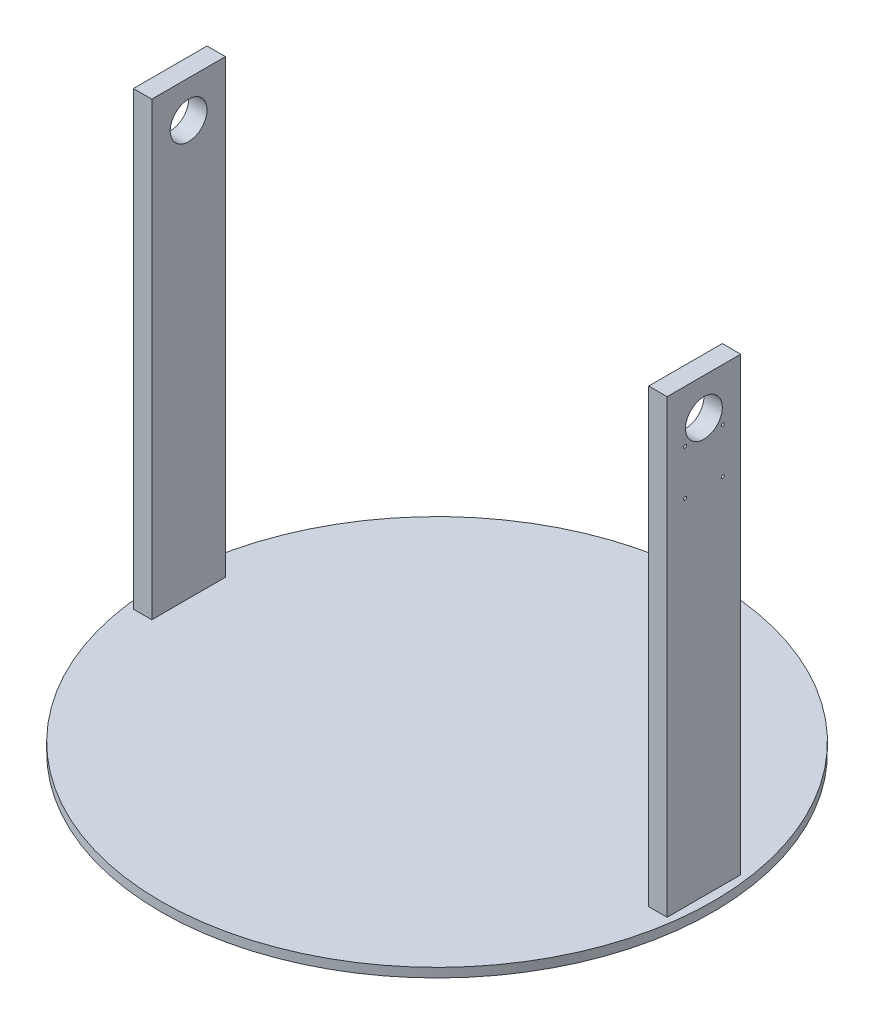
ISO-10303-21;
HEADER;
FILE_DESCRIPTION(('STEP AP214'),'2;1');
FILE_NAME('part.step','',(''),(''),'','','');
FILE_SCHEMA(('AUTOMOTIVE_DESIGN { 1 0 10303 214 1 1 1 1 }'));
ENDSEC;
DATA;
#1=APPLICATION_CONTEXT('core data for automotive mechanical design processes');
#2=APPLICATION_PROTOCOL_DEFINITION('international standard','automotive_design',2000,#1);
#3=PRODUCT_CONTEXT('',#1,'mechanical');
#4=PRODUCT('Part','Part','',(#3));
#5=PRODUCT_RELATED_PRODUCT_CATEGORY('part','',(#4));
#6=PRODUCT_DEFINITION_FORMATION('','',#4);
#7=PRODUCT_DEFINITION_CONTEXT('part definition',#1,'design');
#8=PRODUCT_DEFINITION('design','',#6,#7);
#9=PRODUCT_DEFINITION_SHAPE('','',#8);
#10=(LENGTH_UNIT() NAMED_UNIT(*) SI_UNIT(.MILLI.,.METRE.));
#11=(NAMED_UNIT(*) PLANE_ANGLE_UNIT() SI_UNIT($,.RADIAN.));
#12=(NAMED_UNIT(*) SI_UNIT($,.STERADIAN.) SOLID_ANGLE_UNIT());
#13=UNCERTAINTY_MEASURE_WITH_UNIT(LENGTH_MEASURE(1.E-05),#10,'distance_accuracy_value','');
#14=(GEOMETRIC_REPRESENTATION_CONTEXT(3) GLOBAL_UNCERTAINTY_ASSIGNED_CONTEXT((#13)) GLOBAL_UNIT_ASSIGNED_CONTEXT((#10,
#11,#12)) REPRESENTATION_CONTEXT('',''));
#15=CARTESIAN_POINT('',(0.,0.,0.));
#16=DIRECTION('',(0.,0.,1.));
#17=DIRECTION('',(1.,0.,0.));
#18=AXIS2_PLACEMENT_3D('',#15,#16,#17);
#19=CARTESIAN_POINT('',(-145.,250.,-19.9999999999999));
#20=DIRECTION('',(0.,0.,-1.));
#21=DIRECTION('',(-1.,0.,0.));
#22=AXIS2_PLACEMENT_3D('',#19,#20,#21);
#23=PLANE('',#22);
#24=DIRECTION('',(1.,0.,0.));
#25=VECTOR('',#24,1.);
#26=CARTESIAN_POINT('',(0.,5.,-19.9999999999999));
#27=LINE('',#26,#25);
#28=CARTESIAN_POINT('',(-145.,5.,-19.9999999999999));
#29=VERTEX_POINT('',#28);
#30=CARTESIAN_POINT('',(-135.,5.,-19.9999999999999));
#31=VERTEX_POINT('',#30);
#32=EDGE_CURVE('E62',#29,#31,#27,.T.);
#33=ORIENTED_EDGE('',*,*,#32,.F.);
#34=DIRECTION('',(0.,-1.,0.));
#35=VECTOR('',#34,1.);
#36=CARTESIAN_POINT('',(-145.,250.,-19.9999999999999));
#37=LINE('',#36,#35);
#38=CARTESIAN_POINT('',(-145.,250.,-19.9999999999999));
#39=VERTEX_POINT('',#38);
#40=EDGE_CURVE('E11',#39,#29,#37,.T.);
#41=ORIENTED_EDGE('',*,*,#40,.F.);
#42=DIRECTION('',(1.,0.,0.));
#43=VECTOR('',#42,1.);
#44=CARTESIAN_POINT('',(-145.,250.,-19.9999999999999));
#45=LINE('',#44,#43);
#46=CARTESIAN_POINT('',(-135.,250.,-19.9999999999999));
#47=VERTEX_POINT('',#46);
#48=EDGE_CURVE('E176',#39,#47,#45,.T.);
#49=ORIENTED_EDGE('',*,*,#48,.T.);
#50=DIRECTION('',(0.,-1.,0.));
#51=VECTOR('',#50,1.);
#52=CARTESIAN_POINT('',(-135.,250.,-19.9999999999999));
#53=LINE('',#52,#51);
#54=EDGE_CURVE('E48',#47,#31,#53,.T.);
#55=ORIENTED_EDGE('',*,*,#54,.T.);
#56=EDGE_LOOP('',(#33,#41,#49,#55));
#57=FACE_BOUND('',#56,.T.);
#58=ADVANCED_FACE('F45',(#57),#23,.T.);
#59=CARTESIAN_POINT('',(-145.,250.,-19.9999999999999));
#60=DIRECTION('',(1.,0.,0.));
#61=DIRECTION('',(0.,0.,-1.));
#62=AXIS2_PLACEMENT_3D('',#59,#60,#61);
#63=PLANE('',#62);
#64=CARTESIAN_POINT('',(-145.,230.,0.));
#65=DIRECTION('',(1.,0.,0.));
#66=DIRECTION('',(0.,0.,-1.));
#67=AXIS2_PLACEMENT_3D('',#64,#65,#66);
#68=CIRCLE('',#67,10.);
#69=CARTESIAN_POINT('',(-145.,230.,-10.));
#70=VERTEX_POINT('',#69);
#71=EDGE_CURVE('E318',#70,#70,#68,.T.);
#72=ORIENTED_EDGE('',*,*,#71,.T.);
#73=EDGE_LOOP('',(#72));
#74=FACE_BOUND('',#73,.T.);
#75=ORIENTED_EDGE('',*,*,#40,.T.);
#76=DIRECTION('',(0.,0.,1.));
#77=VECTOR('',#76,1.);
#78=CARTESIAN_POINT('',(-145.,5.,0.));
#79=LINE('',#78,#77);
#80=CARTESIAN_POINT('',(-145.,5.,20.0000000000001));
#81=VERTEX_POINT('',#80);
#82=EDGE_CURVE('E68',#29,#81,#79,.T.);
#83=ORIENTED_EDGE('',*,*,#82,.T.);
#84=DIRECTION('',(0.,-1.,0.));
#85=VECTOR('',#84,1.);
#86=CARTESIAN_POINT('',(-145.,250.,20.0000000000001));
#87=LINE('',#86,#85);
#88=CARTESIAN_POINT('',(-145.,250.,20.0000000000001));
#89=VERTEX_POINT('',#88);
#90=EDGE_CURVE('E54',#89,#81,#87,.T.);
#91=ORIENTED_EDGE('',*,*,#90,.F.);
#92=DIRECTION('',(0.,0.,1.));
#93=VECTOR('',#92,1.);
#94=CARTESIAN_POINT('',(-145.,250.,-19.9999999999999));
#95=LINE('',#94,#93);
#96=EDGE_CURVE('E190',#39,#89,#95,.T.);
#97=ORIENTED_EDGE('',*,*,#96,.F.);
#98=EDGE_LOOP('',(#75,#83,#91,#97));
#99=FACE_BOUND('',#98,.T.);
#100=ADVANCED_FACE('F209',(#74,#99),#63,.F.);
#101=CARTESIAN_POINT('',(-145.,250.,20.0000000000001));
#102=DIRECTION('',(0.,0.,-1.));
#103=DIRECTION('',(-1.,0.,0.));
#104=AXIS2_PLACEMENT_3D('',#101,#102,#103);
#105=PLANE('',#104);
#106=ORIENTED_EDGE('',*,*,#90,.T.);
#107=DIRECTION('',(1.,0.,0.));
#108=VECTOR('',#107,1.);
#109=CARTESIAN_POINT('',(0.,5.,20.0000000000001));
#110=LINE('',#109,#108);
#111=CARTESIAN_POINT('',(-135.,5.,20.0000000000001));
#112=VERTEX_POINT('',#111);
#113=EDGE_CURVE('E152',#81,#112,#110,.T.);
#114=ORIENTED_EDGE('',*,*,#113,.T.);
#115=DIRECTION('',(0.,-1.,0.));
#116=VECTOR('',#115,1.);
#117=CARTESIAN_POINT('',(-135.,250.,20.0000000000001));
#118=LINE('',#117,#116);
#119=CARTESIAN_POINT('',(-135.,250.,20.0000000000001));
#120=VERTEX_POINT('',#119);
#121=EDGE_CURVE('E194',#120,#112,#118,.T.);
#122=ORIENTED_EDGE('',*,*,#121,.F.);
#123=DIRECTION('',(1.,0.,0.));
#124=VECTOR('',#123,1.);
#125=CARTESIAN_POINT('',(-145.,250.,20.0000000000001));
#126=LINE('',#125,#124);
#127=EDGE_CURVE('E187',#89,#120,#126,.T.);
#128=ORIENTED_EDGE('',*,*,#127,.F.);
#129=EDGE_LOOP('',(#106,#114,#122,#128));
#130=FACE_BOUND('',#129,.T.);
#131=ADVANCED_FACE('F206',(#130),#105,.F.);
#132=CARTESIAN_POINT('',(-135.,250.,-19.9999999999999));
#133=DIRECTION('',(1.,0.,0.));
#134=DIRECTION('',(0.,0.,-1.));
#135=AXIS2_PLACEMENT_3D('',#132,#133,#134);
#136=PLANE('',#135);
#137=CARTESIAN_POINT('',(-135.,230.,0.));
#138=DIRECTION('',(1.,0.,0.));
#139=DIRECTION('',(0.,0.,-1.));
#140=AXIS2_PLACEMENT_3D('',#137,#138,#139);
#141=CIRCLE('',#140,10.);
#142=CARTESIAN_POINT('',(-135.,230.,-10.));
#143=VERTEX_POINT('',#142);
#144=EDGE_CURVE('E328',#143,#143,#141,.T.);
#145=ORIENTED_EDGE('',*,*,#144,.F.);
#146=EDGE_LOOP('',(#145));
#147=FACE_BOUND('',#146,.T.);
#148=DIRECTION('',(0.,0.,1.));
#149=VECTOR('',#148,1.);
#150=CARTESIAN_POINT('',(-135.,5.,0.));
#151=LINE('',#150,#149);
#152=EDGE_CURVE('E148',#31,#112,#151,.T.);
#153=ORIENTED_EDGE('',*,*,#152,.F.);
#154=ORIENTED_EDGE('',*,*,#54,.F.);
#155=DIRECTION('',(0.,0.,1.));
#156=VECTOR('',#155,1.);
#157=CARTESIAN_POINT('',(-135.,250.,-19.9999999999999));
#158=LINE('',#157,#156);
#159=EDGE_CURVE('E183',#47,#120,#158,.T.);
#160=ORIENTED_EDGE('',*,*,#159,.T.);
#161=ORIENTED_EDGE('',*,*,#121,.T.);
#162=EDGE_LOOP('',(#153,#154,#160,#161));
#163=FACE_BOUND('',#162,.T.);
#164=ADVANCED_FACE('F212',(#147,#163),#136,.T.);
#165=CARTESIAN_POINT('',(0.,250.,0.));
#166=DIRECTION('',(0.,-1.,0.));
#167=DIRECTION('',(0.,0.,-1.));
#168=AXIS2_PLACEMENT_3D('',#165,#166,#167);
#169=PLANE('',#168);
#170=ORIENTED_EDGE('',*,*,#48,.F.);
#171=ORIENTED_EDGE('',*,*,#96,.T.);
#172=ORIENTED_EDGE('',*,*,#127,.T.);
#173=ORIENTED_EDGE('',*,*,#159,.F.);
#174=EDGE_LOOP('',(#170,#171,#172,#173));
#175=FACE_BOUND('',#174,.T.);
#176=ADVANCED_FACE('F211',(#175),#169,.F.);
#177=CARTESIAN_POINT('',(0.,5.,0.));
#178=DIRECTION('',(0.,-1.,0.));
#179=DIRECTION('',(0.,0.,-1.));
#180=AXIS2_PLACEMENT_3D('',#177,#178,#179);
#181=CYLINDRICAL_SURFACE('',#180,150.);
#182=CARTESIAN_POINT('',(0.,5.,0.));
#183=DIRECTION('',(0.,1.,0.));
#184=DIRECTION('',(0.,0.,1.));
#185=AXIS2_PLACEMENT_3D('',#182,#183,#184);
#186=CIRCLE('',#185,150.);
#187=CARTESIAN_POINT('',(0.,5.,150.));
#188=VERTEX_POINT('',#187);
#189=EDGE_CURVE('E172',#188,#188,#186,.T.);
#190=ORIENTED_EDGE('',*,*,#189,.F.);
#191=EDGE_LOOP('',(#190));
#192=FACE_BOUND('',#191,.T.);
#193=CARTESIAN_POINT('',(0.,0.,0.));
#194=DIRECTION('',(0.,1.,0.));
#195=DIRECTION('',(0.,0.,1.));
#196=AXIS2_PLACEMENT_3D('',#193,#194,#195);
#197=CIRCLE('',#196,150.);
#198=CARTESIAN_POINT('',(0.,0.,150.));
#199=VERTEX_POINT('',#198);
#200=EDGE_CURVE('E133',#199,#199,#197,.T.);
#201=ORIENTED_EDGE('',*,*,#200,.T.);
#202=EDGE_LOOP('',(#201));
#203=FACE_BOUND('',#202,.T.);
#204=ADVANCED_FACE('F220',(#192,#203),#181,.T.);
#205=CARTESIAN_POINT('',(0.,5.,0.));
#206=DIRECTION('',(0.,1.,0.));
#207=DIRECTION('',(0.,0.,1.));
#208=AXIS2_PLACEMENT_3D('',#205,#206,#207);
#209=PLANE('',#208);
#210=ORIENTED_EDGE('',*,*,#152,.T.);
#211=ORIENTED_EDGE('',*,*,#113,.F.);
#212=ORIENTED_EDGE('',*,*,#82,.F.);
#213=ORIENTED_EDGE('',*,*,#32,.T.);
#214=EDGE_LOOP('',(#210,#211,#212,#213));
#215=FACE_BOUND('',#214,.T.);
#216=DIRECTION('',(-1.,0.,0.));
#217=VECTOR('',#216,1.);
#218=CARTESIAN_POINT('',(0.,5.,20.));
#219=LINE('',#218,#217);
#220=CARTESIAN_POINT('',(145.,5.,20.));
#221=VERTEX_POINT('',#220);
#222=CARTESIAN_POINT('',(135.,5.,20.));
#223=VERTEX_POINT('',#222);
#224=EDGE_CURVE('E160',#221,#223,#219,.T.);
#225=ORIENTED_EDGE('',*,*,#224,.T.);
#226=DIRECTION('',(0.,0.,1.));
#227=VECTOR('',#226,1.);
#228=CARTESIAN_POINT('',(135.,5.,0.));
#229=LINE('',#228,#227);
#230=CARTESIAN_POINT('',(135.,5.,-20.));
#231=VERTEX_POINT('',#230);
#232=EDGE_CURVE('E164',#231,#223,#229,.T.);
#233=ORIENTED_EDGE('',*,*,#232,.F.);
#234=DIRECTION('',(-1.,0.,0.));
#235=VECTOR('',#234,1.);
#236=CARTESIAN_POINT('',(0.,5.,-20.));
#237=LINE('',#236,#235);
#238=CARTESIAN_POINT('',(145.,5.,-20.));
#239=VERTEX_POINT('',#238);
#240=EDGE_CURVE('E167',#239,#231,#237,.T.);
#241=ORIENTED_EDGE('',*,*,#240,.F.);
#242=DIRECTION('',(0.,0.,1.));
#243=VECTOR('',#242,1.);
#244=CARTESIAN_POINT('',(145.,5.,0.));
#245=LINE('',#244,#243);
#246=EDGE_CURVE('E119',#239,#221,#245,.T.);
#247=ORIENTED_EDGE('',*,*,#246,.T.);
#248=EDGE_LOOP('',(#225,#233,#241,#247));
#249=FACE_BOUND('',#248,.T.);
#250=ORIENTED_EDGE('',*,*,#189,.T.);
#251=EDGE_LOOP('',(#250));
#252=FACE_BOUND('',#251,.T.);
#253=ADVANCED_FACE('F202',(#215,#249,#252),#209,.T.);
#254=CARTESIAN_POINT('',(0.,0.,0.));
#255=DIRECTION('',(0.,-1.,0.));
#256=DIRECTION('',(0.,0.,-1.));
#257=AXIS2_PLACEMENT_3D('',#254,#255,#256);
#258=PLANE('',#257);
#259=ORIENTED_EDGE('',*,*,#200,.F.);
#260=EDGE_LOOP('',(#259));
#261=FACE_BOUND('',#260,.T.);
#262=ADVANCED_FACE('F235',(#261),#258,.T.);
#263=CARTESIAN_POINT('',(145.,250.,-20.));
#264=DIRECTION('',(0.,0.,1.));
#265=DIRECTION('',(1.,0.,0.));
#266=AXIS2_PLACEMENT_3D('',#263,#264,#265);
#267=PLANE('',#266);
#268=ORIENTED_EDGE('',*,*,#240,.T.);
#269=DIRECTION('',(0.,-1.,0.));
#270=VECTOR('',#269,1.);
#271=CARTESIAN_POINT('',(135.,250.,-20.));
#272=LINE('',#271,#270);
#273=CARTESIAN_POINT('',(135.,250.,-20.));
#274=VERTEX_POINT('',#273);
#275=EDGE_CURVE('E130',#274,#231,#272,.T.);
#276=ORIENTED_EDGE('',*,*,#275,.F.);
#277=DIRECTION('',(-1.,0.,0.));
#278=VECTOR('',#277,1.);
#279=CARTESIAN_POINT('',(145.,250.,-20.));
#280=LINE('',#279,#278);
#281=CARTESIAN_POINT('',(145.,250.,-20.));
#282=VERTEX_POINT('',#281);
#283=EDGE_CURVE('E127',#282,#274,#280,.T.);
#284=ORIENTED_EDGE('',*,*,#283,.F.);
#285=DIRECTION('',(0.,-1.,0.));
#286=VECTOR('',#285,1.);
#287=CARTESIAN_POINT('',(145.,250.,-20.));
#288=LINE('',#287,#286);
#289=EDGE_CURVE('E113',#282,#239,#288,.T.);
#290=ORIENTED_EDGE('',*,*,#289,.T.);
#291=EDGE_LOOP('',(#268,#276,#284,#290));
#292=FACE_BOUND('',#291,.T.);
#293=ADVANCED_FACE('F128',(#292),#267,.F.);
#294=CARTESIAN_POINT('',(135.,250.,-20.));
#295=DIRECTION('',(1.,0.,0.));
#296=DIRECTION('',(0.,0.,-1.));
#297=AXIS2_PLACEMENT_3D('',#294,#295,#296);
#298=PLANE('',#297);
#299=CARTESIAN_POINT('',(135.,221.7,10.25));
#300=DIRECTION('',(1.,0.,0.));
#301=DIRECTION('',(0.,0.,-1.));
#302=AXIS2_PLACEMENT_3D('',#299,#300,#301);
#303=CIRCLE('',#302,0.799999999999999);
#304=CARTESIAN_POINT('',(135.,221.7,9.45000000000001));
#305=VERTEX_POINT('',#304);
#306=EDGE_CURVE('E310',#305,#305,#303,.T.);
#307=ORIENTED_EDGE('',*,*,#306,.T.);
#308=EDGE_LOOP('',(#307));
#309=FACE_BOUND('',#308,.T.);
#310=CARTESIAN_POINT('',(135.,221.7,-10.25));
#311=DIRECTION('',(1.,0.,0.));
#312=DIRECTION('',(0.,0.,-1.));
#313=AXIS2_PLACEMENT_3D('',#310,#311,#312);
#314=CIRCLE('',#313,0.799999999999999);
#315=CARTESIAN_POINT('',(135.,221.7,-11.05));
#316=VERTEX_POINT('',#315);
#317=EDGE_CURVE('E302',#316,#316,#314,.T.);
#318=ORIENTED_EDGE('',*,*,#317,.T.);
#319=EDGE_LOOP('',(#318));
#320=FACE_BOUND('',#319,.T.);
#321=CARTESIAN_POINT('',(135.,197.25,-10.25));
#322=DIRECTION('',(1.,0.,0.));
#323=DIRECTION('',(0.,0.,-1.));
#324=AXIS2_PLACEMENT_3D('',#321,#322,#323);
#325=CIRCLE('',#324,0.799999999999998);
#326=CARTESIAN_POINT('',(135.,197.25,-11.05));
#327=VERTEX_POINT('',#326);
#328=EDGE_CURVE('E283',#327,#327,#325,.T.);
#329=ORIENTED_EDGE('',*,*,#328,.T.);
#330=EDGE_LOOP('',(#329));
#331=FACE_BOUND('',#330,.T.);
#332=CARTESIAN_POINT('',(135.,197.25,10.25));
#333=DIRECTION('',(1.,0.,0.));
#334=DIRECTION('',(0.,0.,-1.));
#335=AXIS2_PLACEMENT_3D('',#332,#333,#334);
#336=CIRCLE('',#335,0.799999999999999);
#337=CARTESIAN_POINT('',(135.,197.25,9.45));
#338=VERTEX_POINT('',#337);
#339=EDGE_CURVE('E294',#338,#338,#336,.T.);
#340=ORIENTED_EDGE('',*,*,#339,.T.);
#341=EDGE_LOOP('',(#340));
#342=FACE_BOUND('',#341,.T.);
#343=CARTESIAN_POINT('',(135.,230.,0.));
#344=DIRECTION('',(1.,0.,0.));
#345=DIRECTION('',(0.,0.,-1.));
#346=AXIS2_PLACEMENT_3D('',#343,#344,#345);
#347=CIRCLE('',#346,10.);
#348=CARTESIAN_POINT('',(135.,230.,-10.));
#349=VERTEX_POINT('',#348);
#350=EDGE_CURVE('E321',#349,#349,#347,.T.);
#351=ORIENTED_EDGE('',*,*,#350,.T.);
#352=EDGE_LOOP('',(#351));
#353=FACE_BOUND('',#352,.T.);
#354=ORIENTED_EDGE('',*,*,#232,.T.);
#355=DIRECTION('',(0.,-1.,0.));
#356=VECTOR('',#355,1.);
#357=CARTESIAN_POINT('',(135.,250.,20.));
#358=LINE('',#357,#356);
#359=CARTESIAN_POINT('',(135.,250.,20.));
#360=VERTEX_POINT('',#359);
#361=EDGE_CURVE('E334',#360,#223,#358,.T.);
#362=ORIENTED_EDGE('',*,*,#361,.F.);
#363=DIRECTION('',(0.,0.,1.));
#364=VECTOR('',#363,1.);
#365=CARTESIAN_POINT('',(135.,250.,-20.));
#366=LINE('',#365,#364);
#367=EDGE_CURVE('E134',#274,#360,#366,.T.);
#368=ORIENTED_EDGE('',*,*,#367,.F.);
#369=ORIENTED_EDGE('',*,*,#275,.T.);
#370=EDGE_LOOP('',(#354,#362,#368,#369));
#371=FACE_BOUND('',#370,.T.);
#372=ADVANCED_FACE('F252',(#309,#320,#331,#342,#353,#371),#298,.F.);
#373=CARTESIAN_POINT('',(145.,250.,20.));
#374=DIRECTION('',(0.,0.,1.));
#375=DIRECTION('',(1.,0.,0.));
#376=AXIS2_PLACEMENT_3D('',#373,#374,#375);
#377=PLANE('',#376);
#378=ORIENTED_EDGE('',*,*,#361,.T.);
#379=ORIENTED_EDGE('',*,*,#224,.F.);
#380=DIRECTION('',(0.,-1.,0.));
#381=VECTOR('',#380,1.);
#382=CARTESIAN_POINT('',(145.,250.,20.));
#383=LINE('',#382,#381);
#384=CARTESIAN_POINT('',(145.,250.,20.));
#385=VERTEX_POINT('',#384);
#386=EDGE_CURVE('E123',#385,#221,#383,.T.);
#387=ORIENTED_EDGE('',*,*,#386,.F.);
#388=DIRECTION('',(-1.,0.,0.));
#389=VECTOR('',#388,1.);
#390=CARTESIAN_POINT('',(145.,250.,20.));
#391=LINE('',#390,#389);
#392=EDGE_CURVE('E139',#385,#360,#391,.T.);
#393=ORIENTED_EDGE('',*,*,#392,.T.);
#394=EDGE_LOOP('',(#378,#379,#387,#393));
#395=FACE_BOUND('',#394,.T.);
#396=ADVANCED_FACE('F248',(#395),#377,.T.);
#397=CARTESIAN_POINT('',(145.,250.,-20.));
#398=DIRECTION('',(1.,0.,0.));
#399=DIRECTION('',(0.,0.,-1.));
#400=AXIS2_PLACEMENT_3D('',#397,#398,#399);
#401=PLANE('',#400);
#402=CARTESIAN_POINT('',(145.,221.7,10.25));
#403=DIRECTION('',(1.,0.,0.));
#404=DIRECTION('',(0.,0.,-1.));
#405=AXIS2_PLACEMENT_3D('',#402,#403,#404);
#406=CIRCLE('',#405,0.799999999999999);
#407=CARTESIAN_POINT('',(145.,221.7,9.45000000000001));
#408=VERTEX_POINT('',#407);
#409=EDGE_CURVE('E306',#408,#408,#406,.T.);
#410=ORIENTED_EDGE('',*,*,#409,.F.);
#411=EDGE_LOOP('',(#410));
#412=FACE_BOUND('',#411,.T.);
#413=CARTESIAN_POINT('',(145.,221.7,-10.25));
#414=DIRECTION('',(1.,0.,0.));
#415=DIRECTION('',(0.,0.,-1.));
#416=AXIS2_PLACEMENT_3D('',#413,#414,#415);
#417=CIRCLE('',#416,0.799999999999999);
#418=CARTESIAN_POINT('',(145.,221.7,-11.05));
#419=VERTEX_POINT('',#418);
#420=EDGE_CURVE('E296',#419,#419,#417,.T.);
#421=ORIENTED_EDGE('',*,*,#420,.F.);
#422=EDGE_LOOP('',(#421));
#423=FACE_BOUND('',#422,.T.);
#424=CARTESIAN_POINT('',(145.,197.25,-10.25));
#425=DIRECTION('',(1.,0.,0.));
#426=DIRECTION('',(0.,0.,-1.));
#427=AXIS2_PLACEMENT_3D('',#424,#425,#426);
#428=CIRCLE('',#427,0.799999999999998);
#429=CARTESIAN_POINT('',(145.,197.25,-11.05));
#430=VERTEX_POINT('',#429);
#431=EDGE_CURVE('E286',#430,#430,#428,.T.);
#432=ORIENTED_EDGE('',*,*,#431,.F.);
#433=EDGE_LOOP('',(#432));
#434=FACE_BOUND('',#433,.T.);
#435=CARTESIAN_POINT('',(145.,197.25,10.25));
#436=DIRECTION('',(1.,0.,0.));
#437=DIRECTION('',(0.,0.,-1.));
#438=AXIS2_PLACEMENT_3D('',#435,#436,#437);
#439=CIRCLE('',#438,0.799999999999999);
#440=CARTESIAN_POINT('',(145.,197.25,9.45));
#441=VERTEX_POINT('',#440);
#442=EDGE_CURVE('E289',#441,#441,#439,.T.);
#443=ORIENTED_EDGE('',*,*,#442,.F.);
#444=EDGE_LOOP('',(#443));
#445=FACE_BOUND('',#444,.T.);
#446=CARTESIAN_POINT('',(145.,230.,0.));
#447=DIRECTION('',(1.,0.,0.));
#448=DIRECTION('',(0.,0.,-1.));
#449=AXIS2_PLACEMENT_3D('',#446,#447,#448);
#450=CIRCLE('',#449,10.);
#451=CARTESIAN_POINT('',(145.,230.,-10.));
#452=VERTEX_POINT('',#451);
#453=EDGE_CURVE('E316',#452,#452,#450,.T.);
#454=ORIENTED_EDGE('',*,*,#453,.F.);
#455=EDGE_LOOP('',(#454));
#456=FACE_BOUND('',#455,.T.);
#457=ORIENTED_EDGE('',*,*,#386,.T.);
#458=ORIENTED_EDGE('',*,*,#246,.F.);
#459=ORIENTED_EDGE('',*,*,#289,.F.);
#460=DIRECTION('',(0.,0.,1.));
#461=VECTOR('',#460,1.);
#462=CARTESIAN_POINT('',(145.,250.,-20.));
#463=LINE('',#462,#461);
#464=EDGE_CURVE('E117',#282,#385,#463,.T.);
#465=ORIENTED_EDGE('',*,*,#464,.T.);
#466=EDGE_LOOP('',(#457,#458,#459,#465));
#467=FACE_BOUND('',#466,.T.);
#468=ADVANCED_FACE('F115',(#412,#423,#434,#445,#456,#467),#401,.T.);
#469=CARTESIAN_POINT('',(0.,250.,0.));
#470=DIRECTION('',(0.,1.,0.));
#471=DIRECTION('',(0.,0.,1.));
#472=AXIS2_PLACEMENT_3D('',#469,#470,#471);
#473=PLANE('',#472);
#474=ORIENTED_EDGE('',*,*,#283,.T.);
#475=ORIENTED_EDGE('',*,*,#367,.T.);
#476=ORIENTED_EDGE('',*,*,#392,.F.);
#477=ORIENTED_EDGE('',*,*,#464,.F.);
#478=EDGE_LOOP('',(#474,#475,#476,#477));
#479=FACE_BOUND('',#478,.T.);
#480=ADVANCED_FACE('F137',(#479),#473,.T.);
#481=CARTESIAN_POINT('',(-145.,230.,0.));
#482=DIRECTION('',(1.,0.,0.));
#483=DIRECTION('',(0.,0.,-1.));
#484=AXIS2_PLACEMENT_3D('',#481,#482,#483);
#485=CYLINDRICAL_SURFACE('',#484,10.);
#486=ORIENTED_EDGE('',*,*,#453,.T.);
#487=EDGE_LOOP('',(#486));
#488=FACE_BOUND('',#487,.T.);
#489=ORIENTED_EDGE('',*,*,#350,.F.);
#490=EDGE_LOOP('',(#489));
#491=FACE_BOUND('',#490,.T.);
#492=ADVANCED_FACE('F245',(#488,#491),#485,.F.);
#493=ORIENTED_EDGE('',*,*,#144,.T.);
#494=EDGE_LOOP('',(#493));
#495=FACE_BOUND('',#494,.T.);
#496=ORIENTED_EDGE('',*,*,#71,.F.);
#497=EDGE_LOOP('',(#496));
#498=FACE_BOUND('',#497,.T.);
#499=ADVANCED_FACE('F259',(#495,#498),#485,.F.);
#500=CARTESIAN_POINT('',(135.,197.25,10.25));
#501=DIRECTION('',(1.,0.,0.));
#502=DIRECTION('',(0.,0.,-1.));
#503=AXIS2_PLACEMENT_3D('',#500,#501,#502);
#504=CYLINDRICAL_SURFACE('',#503,0.799999999999999);
#505=ORIENTED_EDGE('',*,*,#339,.F.);
#506=EDGE_LOOP('',(#505));
#507=FACE_BOUND('',#506,.T.);
#508=ORIENTED_EDGE('',*,*,#442,.T.);
#509=EDGE_LOOP('',(#508));
#510=FACE_BOUND('',#509,.T.);
#511=ADVANCED_FACE('F262',(#507,#510),#504,.F.);
#512=CARTESIAN_POINT('',(135.,197.25,-10.25));
#513=DIRECTION('',(1.,0.,0.));
#514=DIRECTION('',(0.,0.,-1.));
#515=AXIS2_PLACEMENT_3D('',#512,#513,#514);
#516=CYLINDRICAL_SURFACE('',#515,0.799999999999998);
#517=ORIENTED_EDGE('',*,*,#328,.F.);
#518=EDGE_LOOP('',(#517));
#519=FACE_BOUND('',#518,.T.);
#520=ORIENTED_EDGE('',*,*,#431,.T.);
#521=EDGE_LOOP('',(#520));
#522=FACE_BOUND('',#521,.T.);
#523=ADVANCED_FACE('F266',(#519,#522),#516,.F.);
#524=CARTESIAN_POINT('',(135.,221.7,-10.25));
#525=DIRECTION('',(1.,0.,0.));
#526=DIRECTION('',(0.,0.,-1.));
#527=AXIS2_PLACEMENT_3D('',#524,#525,#526);
#528=CYLINDRICAL_SURFACE('',#527,0.799999999999999);
#529=ORIENTED_EDGE('',*,*,#317,.F.);
#530=EDGE_LOOP('',(#529));
#531=FACE_BOUND('',#530,.T.);
#532=ORIENTED_EDGE('',*,*,#420,.T.);
#533=EDGE_LOOP('',(#532));
#534=FACE_BOUND('',#533,.T.);
#535=ADVANCED_FACE('F271',(#531,#534),#528,.F.);
#536=CARTESIAN_POINT('',(135.,221.7,10.25));
#537=DIRECTION('',(1.,0.,0.));
#538=DIRECTION('',(0.,0.,-1.));
#539=AXIS2_PLACEMENT_3D('',#536,#537,#538);
#540=CYLINDRICAL_SURFACE('',#539,0.799999999999999);
#541=ORIENTED_EDGE('',*,*,#306,.F.);
#542=EDGE_LOOP('',(#541));
#543=FACE_BOUND('',#542,.T.);
#544=ORIENTED_EDGE('',*,*,#409,.T.);
#545=EDGE_LOOP('',(#544));
#546=FACE_BOUND('',#545,.T.);
#547=ADVANCED_FACE('F268',(#543,#546),#540,.F.);
#548=CLOSED_SHELL('',(#58,#100,#131,#164,#176,#204,#253,#262,#293,#372,#396,#468,#480,#492,#499,
#511,#523,#535,#547));
#549=MANIFOLD_SOLID_BREP('B2',#548);
#550=ADVANCED_BREP_SHAPE_REPRESENTATION('',(#18,#549),#14);
#551=SHAPE_DEFINITION_REPRESENTATION(#9,#550);
ENDSEC;
END-ISO-10303-21;
